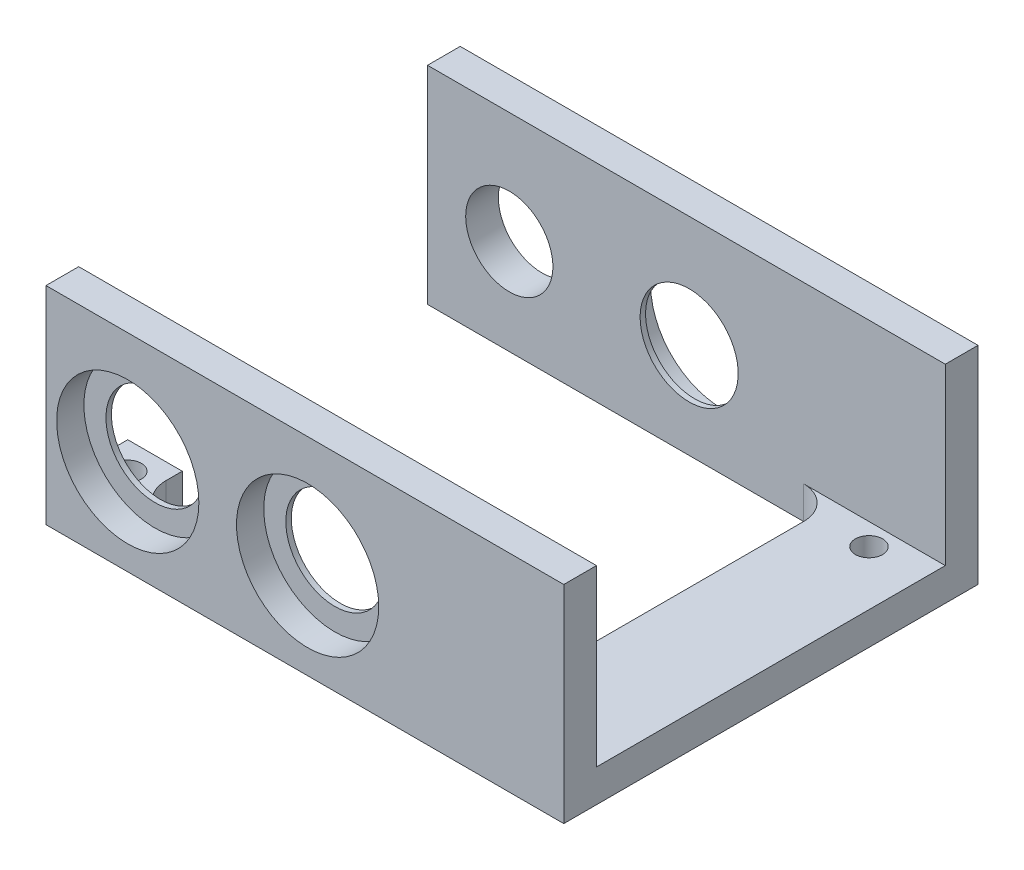
ISO-10303-21;
HEADER;
FILE_DESCRIPTION(('STEP AP214'),'2;1');
FILE_NAME('part.step','',(''),(''),'','','');
FILE_SCHEMA(('AUTOMOTIVE_DESIGN { 1 0 10303 214 1 1 1 1 }'));
ENDSEC;
DATA;
#1=APPLICATION_CONTEXT('core data for automotive mechanical design processes');
#2=APPLICATION_PROTOCOL_DEFINITION('international standard','automotive_design',2000,#1);
#3=PRODUCT_CONTEXT('',#1,'mechanical');
#4=PRODUCT('Part','Part','',(#3));
#5=PRODUCT_RELATED_PRODUCT_CATEGORY('part','',(#4));
#6=PRODUCT_DEFINITION_FORMATION('','',#4);
#7=PRODUCT_DEFINITION_CONTEXT('part definition',#1,'design');
#8=PRODUCT_DEFINITION('design','',#6,#7);
#9=PRODUCT_DEFINITION_SHAPE('','',#8);
#10=(LENGTH_UNIT() NAMED_UNIT(*) SI_UNIT(.MILLI.,.METRE.));
#11=(NAMED_UNIT(*) PLANE_ANGLE_UNIT() SI_UNIT($,.RADIAN.));
#12=(NAMED_UNIT(*) SI_UNIT($,.STERADIAN.) SOLID_ANGLE_UNIT());
#13=UNCERTAINTY_MEASURE_WITH_UNIT(LENGTH_MEASURE(1.E-05),#10,'distance_accuracy_value','');
#14=(GEOMETRIC_REPRESENTATION_CONTEXT(3) GLOBAL_UNCERTAINTY_ASSIGNED_CONTEXT((#13)) GLOBAL_UNIT_ASSIGNED_CONTEXT((#10,
#11,#12)) REPRESENTATION_CONTEXT('',''));
#15=CARTESIAN_POINT('',(0.,0.,0.));
#16=DIRECTION('',(0.,0.,1.));
#17=DIRECTION('',(1.,0.,0.));
#18=AXIS2_PLACEMENT_3D('',#15,#16,#17);
#19=CARTESIAN_POINT('',(8.43808713631623,7.98702095262566,6.));
#20=DIRECTION('',(0.,0.,-1.));
#21=DIRECTION('',(-1.,0.,0.));
#22=AXIS2_PLACEMENT_3D('',#19,#20,#21);
#23=CYLINDRICAL_SURFACE('',#22,9.);
#24=CARTESIAN_POINT('',(8.43808713631623,7.98702095262566,6.));
#25=DIRECTION('',(0.,0.,-1.));
#26=DIRECTION('',(-1.,0.,0.));
#27=AXIS2_PLACEMENT_3D('',#24,#25,#26);
#28=CIRCLE('',#27,9.);
#29=CARTESIAN_POINT('',(-0.561912863683773,7.98702095262566,6.));
#30=VERTEX_POINT('',#29);
#31=EDGE_CURVE('E312',#30,#30,#28,.T.);
#32=ORIENTED_EDGE('',*,*,#31,.F.);
#33=EDGE_LOOP('',(#32));
#34=FACE_BOUND('',#33,.T.);
#35=CARTESIAN_POINT('',(8.43808713631623,7.98702095262566,5.));
#36=DIRECTION('',(0.,0.,-1.));
#37=DIRECTION('',(-1.,0.,0.));
#38=AXIS2_PLACEMENT_3D('',#35,#36,#37);
#39=CIRCLE('',#38,9.);
#40=CARTESIAN_POINT('',(-0.561912863683773,7.98702095262566,5.));
#41=VERTEX_POINT('',#40);
#42=EDGE_CURVE('E308',#41,#41,#39,.F.);
#43=ORIENTED_EDGE('',*,*,#42,.F.);
#44=EDGE_LOOP('',(#43));
#45=FACE_BOUND('',#44,.T.);
#46=ADVANCED_FACE('F42',(#34,#45),#23,.F.);
#47=CARTESIAN_POINT('',(8.43808713631623,7.98702095262566,70.));
#48=DIRECTION('',(0.,0.,1.));
#49=DIRECTION('',(1.,0.,0.));
#50=AXIS2_PLACEMENT_3D('',#47,#48,#49);
#51=CYLINDRICAL_SURFACE('',#50,9.);
#52=CARTESIAN_POINT('',(8.43808713631623,7.98702095262566,70.));
#53=DIRECTION('',(0.,0.,1.));
#54=DIRECTION('',(1.,0.,0.));
#55=AXIS2_PLACEMENT_3D('',#52,#53,#54);
#56=CIRCLE('',#55,9.);
#57=CARTESIAN_POINT('',(17.4380871363162,7.98702095262566,70.));
#58=VERTEX_POINT('',#57);
#59=EDGE_CURVE('E188',#58,#58,#56,.T.);
#60=ORIENTED_EDGE('',*,*,#59,.F.);
#61=EDGE_LOOP('',(#60));
#62=FACE_BOUND('',#61,.T.);
#63=CARTESIAN_POINT('',(8.43808713631623,7.98702095262566,71.));
#64=DIRECTION('',(0.,0.,1.));
#65=DIRECTION('',(1.,0.,0.));
#66=AXIS2_PLACEMENT_3D('',#63,#64,#65);
#67=CIRCLE('',#66,9.);
#68=CARTESIAN_POINT('',(17.4380871363162,7.98702095262566,71.));
#69=VERTEX_POINT('',#68);
#70=EDGE_CURVE('E303',#69,#69,#67,.F.);
#71=ORIENTED_EDGE('',*,*,#70,.F.);
#72=EDGE_LOOP('',(#71));
#73=FACE_BOUND('',#72,.T.);
#74=ADVANCED_FACE('F414',(#62,#73),#51,.F.);
#75=CARTESIAN_POINT('',(-24.5619128636838,7.98702095262566,70.));
#76=DIRECTION('',(0.,0.,1.));
#77=DIRECTION('',(1.,0.,0.));
#78=AXIS2_PLACEMENT_3D('',#75,#76,#77);
#79=CYLINDRICAL_SURFACE('',#78,9.);
#80=CARTESIAN_POINT('',(-24.5619128636838,7.98702095262566,70.));
#81=DIRECTION('',(0.,0.,1.));
#82=DIRECTION('',(1.,0.,0.));
#83=AXIS2_PLACEMENT_3D('',#80,#81,#82);
#84=CIRCLE('',#83,9.);
#85=CARTESIAN_POINT('',(-15.5619128636838,7.98702095262566,70.));
#86=VERTEX_POINT('',#85);
#87=EDGE_CURVE('E196',#86,#86,#84,.T.);
#88=ORIENTED_EDGE('',*,*,#87,.F.);
#89=EDGE_LOOP('',(#88));
#90=FACE_BOUND('',#89,.T.);
#91=CARTESIAN_POINT('',(-24.5619128636838,7.98702095262566,71.));
#92=DIRECTION('',(0.,0.,1.));
#93=DIRECTION('',(1.,0.,0.));
#94=AXIS2_PLACEMENT_3D('',#91,#92,#93);
#95=CIRCLE('',#94,9.);
#96=CARTESIAN_POINT('',(-15.5619128636838,7.98702095262566,71.));
#97=VERTEX_POINT('',#96);
#98=EDGE_CURVE('E299',#97,#97,#95,.F.);
#99=ORIENTED_EDGE('',*,*,#98,.F.);
#100=EDGE_LOOP('',(#99));
#101=FACE_BOUND('',#100,.T.);
#102=ADVANCED_FACE('F420',(#90,#101),#79,.F.);
#103=CARTESIAN_POINT('',(-39.5619128636838,28.4870209526257,6.));
#104=DIRECTION('',(1.,0.,0.));
#105=DIRECTION('',(0.,0.,-1.));
#106=AXIS2_PLACEMENT_3D('',#103,#104,#105);
#107=PLANE('',#106);
#108=DIRECTION('',(0.,-1.,0.));
#109=VECTOR('',#108,1.);
#110=CARTESIAN_POINT('',(-39.5619128636838,28.4870209526257,0.));
#111=LINE('',#110,#109);
#112=CARTESIAN_POINT('',(-39.5619128636838,28.4870209526257,0.));
#113=VERTEX_POINT('',#112);
#114=CARTESIAN_POINT('',(-39.5619128636838,-9.51297904737435,0.));
#115=VERTEX_POINT('',#114);
#116=EDGE_CURVE('E252',#113,#115,#111,.T.);
#117=ORIENTED_EDGE('',*,*,#116,.T.);
#118=DIRECTION('',(0.,0.,-1.));
#119=VECTOR('',#118,1.);
#120=CARTESIAN_POINT('',(-39.5619128636838,-9.51297904737435,6.));
#121=LINE('',#120,#119);
#122=CARTESIAN_POINT('',(-39.5619128636838,-9.51297904737435,6.));
#123=VERTEX_POINT('',#122);
#124=EDGE_CURVE('E294',#123,#115,#121,.T.);
#125=ORIENTED_EDGE('',*,*,#124,.F.);
#126=DIRECTION('',(0.,-1.,0.));
#127=VECTOR('',#126,1.);
#128=CARTESIAN_POINT('',(-39.5619128636838,28.4870209526257,6.));
#129=LINE('',#128,#127);
#130=CARTESIAN_POINT('',(-39.5619128636838,28.4870209526257,6.));
#131=VERTEX_POINT('',#130);
#132=EDGE_CURVE('E256',#131,#123,#129,.T.);
#133=ORIENTED_EDGE('',*,*,#132,.F.);
#134=DIRECTION('',(0.,0.,-1.));
#135=VECTOR('',#134,1.);
#136=CARTESIAN_POINT('',(-39.5619128636838,28.4870209526257,6.));
#137=LINE('',#136,#135);
#138=EDGE_CURVE('E271',#131,#113,#137,.T.);
#139=ORIENTED_EDGE('',*,*,#138,.T.);
#140=EDGE_LOOP('',(#117,#125,#133,#139));
#141=FACE_BOUND('',#140,.T.);
#142=ADVANCED_FACE('F395',(#141),#107,.F.);
#143=CARTESIAN_POINT('',(-39.5619128636838,-9.51297904737435,6.));
#144=DIRECTION('',(0.,1.,0.));
#145=DIRECTION('',(0.,0.,1.));
#146=AXIS2_PLACEMENT_3D('',#143,#144,#145);
#147=PLANE('',#146);
#148=CARTESIAN_POINT('',(45.4375345031116,-9.51297904737435,10.));
#149=DIRECTION('',(0.,1.,0.));
#150=DIRECTION('',(0.,0.,1.));
#151=AXIS2_PLACEMENT_3D('',#148,#149,#150);
#152=CIRCLE('',#151,2.5);
#153=CARTESIAN_POINT('',(45.4375345031116,-9.51297904737435,12.5));
#154=VERTEX_POINT('',#153);
#155=EDGE_CURVE('E540',#154,#154,#152,.T.);
#156=ORIENTED_EDGE('',*,*,#155,.T.);
#157=EDGE_LOOP('',(#156));
#158=FACE_BOUND('',#157,.T.);
#159=CARTESIAN_POINT('',(45.4375345031116,-9.51297904737435,66.));
#160=DIRECTION('',(0.,1.,0.));
#161=DIRECTION('',(0.,0.,1.));
#162=AXIS2_PLACEMENT_3D('',#159,#160,#161);
#163=CIRCLE('',#162,2.5);
#164=CARTESIAN_POINT('',(45.4375345031116,-9.51297904737435,68.5));
#165=VERTEX_POINT('',#164);
#166=EDGE_CURVE('E552',#165,#165,#163,.T.);
#167=ORIENTED_EDGE('',*,*,#166,.T.);
#168=EDGE_LOOP('',(#167));
#169=FACE_BOUND('',#168,.T.);
#170=CARTESIAN_POINT('',(-34.5619128636838,-9.51297904737435,66.));
#171=DIRECTION('',(0.,1.,0.));
#172=DIRECTION('',(0.,0.,1.));
#173=AXIS2_PLACEMENT_3D('',#170,#171,#172);
#174=CIRCLE('',#173,2.5);
#175=CARTESIAN_POINT('',(-34.5619128636838,-9.51297904737435,68.5));
#176=VERTEX_POINT('',#175);
#177=EDGE_CURVE('E544',#176,#176,#174,.T.);
#178=ORIENTED_EDGE('',*,*,#177,.T.);
#179=EDGE_LOOP('',(#178));
#180=FACE_BOUND('',#179,.T.);
#181=DIRECTION('',(1.,0.,0.));
#182=VECTOR('',#181,1.);
#183=CARTESIAN_POINT('',(-39.5619128636838,-9.51297904737435,0.));
#184=LINE('',#183,#182);
#185=CARTESIAN_POINT('',(55.4380871363162,-9.51297904737435,0.));
#186=VERTEX_POINT('',#185);
#187=EDGE_CURVE('E275',#115,#186,#184,.T.);
#188=ORIENTED_EDGE('',*,*,#187,.T.);
#189=DIRECTION('',(0.,0.,-1.));
#190=VECTOR('',#189,1.);
#191=CARTESIAN_POINT('',(55.4380871363162,-9.51297904737435,6.));
#192=LINE('',#191,#190);
#193=CARTESIAN_POINT('',(55.4380871363162,-9.51297904737435,76.));
#194=VERTEX_POINT('',#193);
#195=EDGE_CURVE('E290',#194,#186,#192,.T.);
#196=ORIENTED_EDGE('',*,*,#195,.F.);
#197=DIRECTION('',(1.,0.,0.));
#198=VECTOR('',#197,1.);
#199=CARTESIAN_POINT('',(-39.5619128636838,-9.51297904737435,76.));
#200=LINE('',#199,#198);
#201=CARTESIAN_POINT('',(-39.5619128636838,-9.51297904737435,76.));
#202=VERTEX_POINT('',#201);
#203=EDGE_CURVE('E204',#202,#194,#200,.T.);
#204=ORIENTED_EDGE('',*,*,#203,.F.);
#205=DIRECTION('',(0.,0.,-1.));
#206=VECTOR('',#205,1.);
#207=CARTESIAN_POINT('',(-39.5619128636838,-9.51297904737435,76.));
#208=LINE('',#207,#206);
#209=CARTESIAN_POINT('',(-39.5619128636838,-9.51297904737435,61.));
#210=VERTEX_POINT('',#209);
#211=EDGE_CURVE('E233',#202,#210,#208,.T.);
#212=ORIENTED_EDGE('',*,*,#211,.T.);
#213=DIRECTION('',(1.,0.,0.));
#214=VECTOR('',#213,1.);
#215=CARTESIAN_POINT('',(-39.5619128636838,-9.51297904737435,61.));
#216=LINE('',#215,#214);
#217=CARTESIAN_POINT('',(-29.5619128636838,-9.51297904737435,61.));
#218=VERTEX_POINT('',#217);
#219=EDGE_CURVE('E161',#210,#218,#216,.T.);
#220=ORIENTED_EDGE('',*,*,#219,.T.);
#221=DIRECTION('',(0.,0.,1.));
#222=VECTOR('',#221,1.);
#223=CARTESIAN_POINT('',(-29.5619128636838,-9.51297904737435,70.));
#224=LINE('',#223,#222);
#225=CARTESIAN_POINT('',(-29.5619128636838,-9.51297904737435,64.));
#226=VERTEX_POINT('',#225);
#227=EDGE_CURVE('E181',#218,#226,#224,.T.);
#228=ORIENTED_EDGE('',*,*,#227,.T.);
#229=CARTESIAN_POINT('',(-23.5619128636838,-9.51297904737435,64.));
#230=DIRECTION('',(0.,1.,0.));
#231=DIRECTION('',(0.,0.,1.));
#232=AXIS2_PLACEMENT_3D('',#229,#230,#231);
#233=CIRCLE('',#232,6.);
#234=CARTESIAN_POINT('',(-23.5619128636838,-9.51297904737435,70.));
#235=VERTEX_POINT('',#234);
#236=EDGE_CURVE('E51',#226,#235,#233,.T.);
#237=ORIENTED_EDGE('',*,*,#236,.T.);
#238=DIRECTION('',(1.,0.,0.));
#239=VECTOR('',#238,1.);
#240=CARTESIAN_POINT('',(-39.5619128636838,-9.51297904737435,70.));
#241=LINE('',#240,#239);
#242=CARTESIAN_POINT('',(29.4369818699069,-9.51297904737435,70.));
#243=VERTEX_POINT('',#242);
#244=EDGE_CURVE('E218',#235,#243,#241,.T.);
#245=ORIENTED_EDGE('',*,*,#244,.T.);
#246=CARTESIAN_POINT('',(29.4369818699069,-9.51297904737435,64.));
#247=DIRECTION('',(0.,1.,0.));
#248=DIRECTION('',(0.,0.,1.));
#249=AXIS2_PLACEMENT_3D('',#246,#247,#248);
#250=CIRCLE('',#249,6.);
#251=CARTESIAN_POINT('',(35.4369818699069,-9.51297904737435,64.));
#252=VERTEX_POINT('',#251);
#253=EDGE_CURVE('E341',#243,#252,#250,.T.);
#254=ORIENTED_EDGE('',*,*,#253,.T.);
#255=DIRECTION('',(0.,0.,-1.));
#256=VECTOR('',#255,1.);
#257=CARTESIAN_POINT('',(35.4369818699069,-9.51297904737435,6.));
#258=LINE('',#257,#256);
#259=CARTESIAN_POINT('',(35.4369818699069,-9.51297904737435,12.));
#260=VERTEX_POINT('',#259);
#261=EDGE_CURVE('E236',#252,#260,#258,.T.);
#262=ORIENTED_EDGE('',*,*,#261,.T.);
#263=CARTESIAN_POINT('',(29.4369818699069,-9.51297904737435,12.));
#264=DIRECTION('',(0.,1.,0.));
#265=DIRECTION('',(0.,0.,1.));
#266=AXIS2_PLACEMENT_3D('',#263,#264,#265);
#267=CIRCLE('',#266,6.);
#268=CARTESIAN_POINT('',(29.4369818699069,-9.51297904737435,6.));
#269=VERTEX_POINT('',#268);
#270=EDGE_CURVE('E335',#260,#269,#267,.T.);
#271=ORIENTED_EDGE('',*,*,#270,.T.);
#272=DIRECTION('',(1.,0.,0.));
#273=VECTOR('',#272,1.);
#274=CARTESIAN_POINT('',(-39.5619128636838,-9.51297904737435,6.));
#275=LINE('',#274,#273);
#276=EDGE_CURVE('E260',#123,#269,#275,.T.);
#277=ORIENTED_EDGE('',*,*,#276,.F.);
#278=ORIENTED_EDGE('',*,*,#124,.T.);
#279=EDGE_LOOP('',(#188,#196,#204,#212,#220,#228,#237,#245,#254,#262,#271,#277,#278));
#280=FACE_BOUND('',#279,.T.);
#281=ADVANCED_FACE('F351',(#158,#169,#180,#280),#147,.F.);
#282=CARTESIAN_POINT('',(55.4380871363162,28.4870209526257,6.));
#283=DIRECTION('',(-1.,0.,0.));
#284=DIRECTION('',(0.,-1.,0.));
#285=AXIS2_PLACEMENT_3D('',#282,#283,#284);
#286=PLANE('',#285);
#287=DIRECTION('',(0.,1.,0.));
#288=VECTOR('',#287,1.);
#289=CARTESIAN_POINT('',(55.4380871363162,28.4870209526257,0.));
#290=LINE('',#289,#288);
#291=CARTESIAN_POINT('',(55.4380871363162,28.4870209526257,0.));
#292=VERTEX_POINT('',#291);
#293=EDGE_CURVE('E278',#186,#292,#290,.T.);
#294=ORIENTED_EDGE('',*,*,#293,.T.);
#295=DIRECTION('',(0.,0.,-1.));
#296=VECTOR('',#295,1.);
#297=CARTESIAN_POINT('',(55.4380871363162,28.4870209526257,6.));
#298=LINE('',#297,#296);
#299=CARTESIAN_POINT('',(55.4380871363162,28.4870209526257,6.));
#300=VERTEX_POINT('',#299);
#301=EDGE_CURVE('E286',#300,#292,#298,.T.);
#302=ORIENTED_EDGE('',*,*,#301,.F.);
#303=DIRECTION('',(0.,1.,0.));
#304=VECTOR('',#303,1.);
#305=CARTESIAN_POINT('',(55.4380871363162,28.4870209526257,6.));
#306=LINE('',#305,#304);
#307=CARTESIAN_POINT('',(55.4380871363162,-3.51297904737435,6.));
#308=VERTEX_POINT('',#307);
#309=EDGE_CURVE('E265',#308,#300,#306,.T.);
#310=ORIENTED_EDGE('',*,*,#309,.F.);
#311=DIRECTION('',(0.,0.,1.));
#312=VECTOR('',#311,1.);
#313=CARTESIAN_POINT('',(55.4380871363162,-3.51297904737434,6.));
#314=LINE('',#313,#312);
#315=CARTESIAN_POINT('',(55.4380871363162,-3.51297904737434,70.));
#316=VERTEX_POINT('',#315);
#317=EDGE_CURVE('E237',#308,#316,#314,.T.);
#318=ORIENTED_EDGE('',*,*,#317,.T.);
#319=DIRECTION('',(0.,1.,0.));
#320=VECTOR('',#319,1.);
#321=CARTESIAN_POINT('',(55.4380871363162,28.4870209526257,70.));
#322=LINE('',#321,#320);
#323=CARTESIAN_POINT('',(55.4380871363162,28.4870209526257,70.));
#324=VERTEX_POINT('',#323);
#325=EDGE_CURVE('E222',#316,#324,#322,.T.);
#326=ORIENTED_EDGE('',*,*,#325,.T.);
#327=DIRECTION('',(0.,0.,-1.));
#328=VECTOR('',#327,1.);
#329=CARTESIAN_POINT('',(55.4380871363162,28.4870209526257,76.));
#330=LINE('',#329,#328);
#331=CARTESIAN_POINT('',(55.4380871363162,28.4870209526257,76.));
#332=VERTEX_POINT('',#331);
#333=EDGE_CURVE('E229',#332,#324,#330,.T.);
#334=ORIENTED_EDGE('',*,*,#333,.F.);
#335=DIRECTION('',(0.,1.,0.));
#336=VECTOR('',#335,1.);
#337=CARTESIAN_POINT('',(55.4380871363162,28.4870209526257,76.));
#338=LINE('',#337,#336);
#339=EDGE_CURVE('E209',#194,#332,#338,.T.);
#340=ORIENTED_EDGE('',*,*,#339,.F.);
#341=ORIENTED_EDGE('',*,*,#195,.T.);
#342=EDGE_LOOP('',(#294,#302,#310,#318,#326,#334,#340,#341));
#343=FACE_BOUND('',#342,.T.);
#344=ADVANCED_FACE('F370',(#343),#286,.F.);
#345=CARTESIAN_POINT('',(-39.5619128636838,28.4870209526257,6.));
#346=DIRECTION('',(0.,-1.,0.));
#347=DIRECTION('',(0.,0.,-1.));
#348=AXIS2_PLACEMENT_3D('',#345,#346,#347);
#349=PLANE('',#348);
#350=DIRECTION('',(-1.,0.,0.));
#351=VECTOR('',#350,1.);
#352=CARTESIAN_POINT('',(-39.5619128636838,28.4870209526257,0.));
#353=LINE('',#352,#351);
#354=EDGE_CURVE('E261',#292,#113,#353,.T.);
#355=ORIENTED_EDGE('',*,*,#354,.T.);
#356=ORIENTED_EDGE('',*,*,#138,.F.);
#357=DIRECTION('',(-1.,0.,0.));
#358=VECTOR('',#357,1.);
#359=CARTESIAN_POINT('',(-39.5619128636838,28.4870209526257,6.));
#360=LINE('',#359,#358);
#361=EDGE_CURVE('E268',#300,#131,#360,.T.);
#362=ORIENTED_EDGE('',*,*,#361,.F.);
#363=ORIENTED_EDGE('',*,*,#301,.T.);
#364=EDGE_LOOP('',(#355,#356,#362,#363));
#365=FACE_BOUND('',#364,.T.);
#366=ADVANCED_FACE('F402',(#365),#349,.F.);
#367=CARTESIAN_POINT('',(0.,0.,6.));
#368=DIRECTION('',(0.,0.,1.));
#369=DIRECTION('',(1.,0.,0.));
#370=AXIS2_PLACEMENT_3D('',#367,#368,#369);
#371=PLANE('',#370);
#372=CARTESIAN_POINT('',(-24.5619128636838,7.98702095262566,6.));
#373=DIRECTION('',(0.,0.,-1.));
#374=DIRECTION('',(-1.,0.,0.));
#375=AXIS2_PLACEMENT_3D('',#372,#373,#374);
#376=CIRCLE('',#375,8.);
#377=CARTESIAN_POINT('',(-32.5619128636838,7.98702095262566,6.));
#378=VERTEX_POINT('',#377);
#379=EDGE_CURVE('E482',#378,#378,#376,.T.);
#380=ORIENTED_EDGE('',*,*,#379,.T.);
#381=EDGE_LOOP('',(#380));
#382=FACE_BOUND('',#381,.T.);
#383=ORIENTED_EDGE('',*,*,#31,.T.);
#384=EDGE_LOOP('',(#383));
#385=FACE_BOUND('',#384,.T.);
#386=ORIENTED_EDGE('',*,*,#276,.T.);
#387=DIRECTION('',(0.,-1.,0.));
#388=VECTOR('',#387,1.);
#389=CARTESIAN_POINT('',(29.4369818699069,-3.51297904737434,6.));
#390=LINE('',#389,#388);
#391=CARTESIAN_POINT('',(29.4369818699069,-3.51297904737434,6.));
#392=VERTEX_POINT('',#391);
#393=EDGE_CURVE('E320',#269,#392,#390,.F.);
#394=ORIENTED_EDGE('',*,*,#393,.T.);
#395=DIRECTION('',(1.,0.,0.));
#396=VECTOR('',#395,1.);
#397=CARTESIAN_POINT('',(55.4380871363162,-3.51297904737434,6.));
#398=LINE('',#397,#396);
#399=EDGE_CURVE('E248',#392,#308,#398,.T.);
#400=ORIENTED_EDGE('',*,*,#399,.T.);
#401=ORIENTED_EDGE('',*,*,#309,.T.);
#402=ORIENTED_EDGE('',*,*,#361,.T.);
#403=ORIENTED_EDGE('',*,*,#132,.T.);
#404=EDGE_LOOP('',(#386,#394,#400,#401,#402,#403));
#405=FACE_BOUND('',#404,.T.);
#406=ADVANCED_FACE('F376',(#382,#385,#405),#371,.T.);
#407=CARTESIAN_POINT('',(0.,0.,0.));
#408=DIRECTION('',(0.,0.,1.));
#409=DIRECTION('',(1.,0.,0.));
#410=AXIS2_PLACEMENT_3D('',#407,#408,#409);
#411=PLANE('',#410);
#412=CARTESIAN_POINT('',(8.43808713631623,7.98702095262566,0.));
#413=DIRECTION('',(0.,0.,-1.));
#414=DIRECTION('',(-1.,0.,0.));
#415=AXIS2_PLACEMENT_3D('',#412,#413,#414);
#416=CIRCLE('',#415,13.05);
#417=CARTESIAN_POINT('',(-4.61191286368377,7.98702095262566,0.));
#418=VERTEX_POINT('',#417);
#419=EDGE_CURVE('E476',#418,#418,#416,.T.);
#420=ORIENTED_EDGE('',*,*,#419,.F.);
#421=EDGE_LOOP('',(#420));
#422=FACE_BOUND('',#421,.T.);
#423=CARTESIAN_POINT('',(-24.5619128636838,7.98702095262566,0.));
#424=DIRECTION('',(0.,0.,-1.));
#425=DIRECTION('',(-1.,0.,0.));
#426=AXIS2_PLACEMENT_3D('',#423,#424,#425);
#427=CIRCLE('',#426,8.);
#428=CARTESIAN_POINT('',(-32.5619128636838,7.98702095262566,0.));
#429=VERTEX_POINT('',#428);
#430=EDGE_CURVE('E479',#429,#429,#427,.T.);
#431=ORIENTED_EDGE('',*,*,#430,.F.);
#432=EDGE_LOOP('',(#431));
#433=FACE_BOUND('',#432,.T.);
#434=ORIENTED_EDGE('',*,*,#116,.F.);
#435=ORIENTED_EDGE('',*,*,#354,.F.);
#436=ORIENTED_EDGE('',*,*,#293,.F.);
#437=ORIENTED_EDGE('',*,*,#187,.F.);
#438=EDGE_LOOP('',(#434,#435,#436,#437));
#439=FACE_BOUND('',#438,.T.);
#440=ADVANCED_FACE('F399',(#422,#433,#439),#411,.F.);
#441=CARTESIAN_POINT('',(35.4369818699069,-3.51297904737434,6.));
#442=DIRECTION('',(-1.,0.,0.));
#443=DIRECTION('',(0.,0.,1.));
#444=AXIS2_PLACEMENT_3D('',#441,#442,#443);
#445=PLANE('',#444);
#446=DIRECTION('',(0.,0.,-1.));
#447=VECTOR('',#446,1.);
#448=CARTESIAN_POINT('',(35.4369818699069,-3.51297904737434,6.));
#449=LINE('',#448,#447);
#450=CARTESIAN_POINT('',(35.4369818699069,-3.51297904737434,64.));
#451=VERTEX_POINT('',#450);
#452=CARTESIAN_POINT('',(35.4369818699069,-3.51297904737434,12.));
#453=VERTEX_POINT('',#452);
#454=EDGE_CURVE('E244',#451,#453,#449,.T.);
#455=ORIENTED_EDGE('',*,*,#454,.T.);
#456=DIRECTION('',(0.,-1.,0.));
#457=VECTOR('',#456,1.);
#458=CARTESIAN_POINT('',(35.4369818699069,-9.51297904737435,12.));
#459=LINE('',#458,#457);
#460=EDGE_CURVE('E316',#453,#260,#459,.T.);
#461=ORIENTED_EDGE('',*,*,#460,.T.);
#462=ORIENTED_EDGE('',*,*,#261,.F.);
#463=DIRECTION('',(0.,-1.,0.));
#464=VECTOR('',#463,1.);
#465=CARTESIAN_POINT('',(35.4369818699069,-3.51297904737434,64.));
#466=LINE('',#465,#464);
#467=EDGE_CURVE('E298',#252,#451,#466,.F.);
#468=ORIENTED_EDGE('',*,*,#467,.T.);
#469=EDGE_LOOP('',(#455,#461,#462,#468));
#470=FACE_BOUND('',#469,.T.);
#471=ADVANCED_FACE('F385',(#470),#445,.T.);
#472=CARTESIAN_POINT('',(0.,-3.51297904737434,0.));
#473=DIRECTION('',(0.,-1.,0.));
#474=DIRECTION('',(0.,0.,-1.));
#475=AXIS2_PLACEMENT_3D('',#472,#473,#474);
#476=PLANE('',#475);
#477=CARTESIAN_POINT('',(45.4375345031116,-3.51297904737434,10.));
#478=DIRECTION('',(0.,1.,0.));
#479=DIRECTION('',(0.,0.,1.));
#480=AXIS2_PLACEMENT_3D('',#477,#478,#479);
#481=CIRCLE('',#480,2.5);
#482=CARTESIAN_POINT('',(45.4375345031116,-3.51297904737434,12.5));
#483=VERTEX_POINT('',#482);
#484=EDGE_CURVE('E560',#483,#483,#481,.T.);
#485=ORIENTED_EDGE('',*,*,#484,.F.);
#486=EDGE_LOOP('',(#485));
#487=FACE_BOUND('',#486,.T.);
#488=CARTESIAN_POINT('',(45.4375345031116,-3.51297904737434,66.));
#489=DIRECTION('',(0.,1.,0.));
#490=DIRECTION('',(0.,0.,1.));
#491=AXIS2_PLACEMENT_3D('',#488,#489,#490);
#492=CIRCLE('',#491,2.5);
#493=CARTESIAN_POINT('',(45.4375345031116,-3.51297904737434,68.5));
#494=VERTEX_POINT('',#493);
#495=EDGE_CURVE('E556',#494,#494,#492,.T.);
#496=ORIENTED_EDGE('',*,*,#495,.F.);
#497=EDGE_LOOP('',(#496));
#498=FACE_BOUND('',#497,.T.);
#499=ORIENTED_EDGE('',*,*,#317,.F.);
#500=ORIENTED_EDGE('',*,*,#399,.F.);
#501=CARTESIAN_POINT('',(29.4369818699069,-3.51297904737434,12.));
#502=DIRECTION('',(0.,-1.,0.));
#503=DIRECTION('',(0.,0.,-1.));
#504=AXIS2_PLACEMENT_3D('',#501,#502,#503);
#505=CIRCLE('',#504,6.);
#506=EDGE_CURVE('E338',#392,#453,#505,.T.);
#507=ORIENTED_EDGE('',*,*,#506,.T.);
#508=ORIENTED_EDGE('',*,*,#454,.F.);
#509=CARTESIAN_POINT('',(29.4369818699069,-3.51297904737434,64.));
#510=DIRECTION('',(0.,-1.,0.));
#511=DIRECTION('',(0.,0.,-1.));
#512=AXIS2_PLACEMENT_3D('',#509,#510,#511);
#513=CIRCLE('',#512,6.);
#514=CARTESIAN_POINT('',(29.4369818699069,-3.51297904737434,70.));
#515=VERTEX_POINT('',#514);
#516=EDGE_CURVE('E344',#451,#515,#513,.T.);
#517=ORIENTED_EDGE('',*,*,#516,.T.);
#518=DIRECTION('',(-1.,0.,0.));
#519=VECTOR('',#518,1.);
#520=CARTESIAN_POINT('',(55.4380871363162,-3.51297904737434,70.));
#521=LINE('',#520,#519);
#522=EDGE_CURVE('E241',#316,#515,#521,.T.);
#523=ORIENTED_EDGE('',*,*,#522,.F.);
#524=EDGE_LOOP('',(#499,#500,#507,#508,#517,#523));
#525=FACE_BOUND('',#524,.T.);
#526=ADVANCED_FACE('F374',(#487,#498,#525),#476,.F.);
#527=CARTESIAN_POINT('',(0.,0.,70.));
#528=DIRECTION('',(0.,0.,1.));
#529=DIRECTION('',(1.,0.,0.));
#530=AXIS2_PLACEMENT_3D('',#527,#528,#529);
#531=PLANE('',#530);
#532=ORIENTED_EDGE('',*,*,#87,.T.);
#533=EDGE_LOOP('',(#532));
#534=FACE_BOUND('',#533,.T.);
#535=ORIENTED_EDGE('',*,*,#59,.T.);
#536=EDGE_LOOP('',(#535));
#537=FACE_BOUND('',#536,.T.);
#538=ORIENTED_EDGE('',*,*,#522,.T.);
#539=DIRECTION('',(0.,-1.,0.));
#540=VECTOR('',#539,1.);
#541=CARTESIAN_POINT('',(29.4369818699069,0.,70.));
#542=LINE('',#541,#540);
#543=EDGE_CURVE('E328',#515,#243,#542,.T.);
#544=ORIENTED_EDGE('',*,*,#543,.T.);
#545=ORIENTED_EDGE('',*,*,#244,.F.);
#546=DIRECTION('',(0.,-1.,0.));
#547=VECTOR('',#546,1.);
#548=CARTESIAN_POINT('',(-23.5619128636838,0.,70.));
#549=LINE('',#548,#547);
#550=CARTESIAN_POINT('',(-23.5619128636838,-3.51297904737434,70.));
#551=VERTEX_POINT('',#550);
#552=EDGE_CURVE('E324',#235,#551,#549,.F.);
#553=ORIENTED_EDGE('',*,*,#552,.T.);
#554=DIRECTION('',(-1.,0.,0.));
#555=VECTOR('',#554,1.);
#556=CARTESIAN_POINT('',(-39.5619128636838,-3.51297904737434,70.));
#557=LINE('',#556,#555);
#558=CARTESIAN_POINT('',(-39.5619128636838,-3.51297904737434,70.));
#559=VERTEX_POINT('',#558);
#560=EDGE_CURVE('E167',#551,#559,#557,.T.);
#561=ORIENTED_EDGE('',*,*,#560,.T.);
#562=DIRECTION('',(0.,-1.,0.));
#563=VECTOR('',#562,1.);
#564=CARTESIAN_POINT('',(-39.5619128636838,28.4870209526257,70.));
#565=LINE('',#564,#563);
#566=CARTESIAN_POINT('',(-39.5619128636838,28.4870209526257,70.));
#567=VERTEX_POINT('',#566);
#568=EDGE_CURVE('E179',#567,#559,#565,.T.);
#569=ORIENTED_EDGE('',*,*,#568,.F.);
#570=DIRECTION('',(-1.,0.,0.));
#571=VECTOR('',#570,1.);
#572=CARTESIAN_POINT('',(-39.5619128636838,28.4870209526257,70.));
#573=LINE('',#572,#571);
#574=EDGE_CURVE('E205',#324,#567,#573,.T.);
#575=ORIENTED_EDGE('',*,*,#574,.F.);
#576=ORIENTED_EDGE('',*,*,#325,.F.);
#577=EDGE_LOOP('',(#538,#544,#545,#553,#561,#569,#575,#576));
#578=FACE_BOUND('',#577,.T.);
#579=ADVANCED_FACE('F354',(#534,#537,#578),#531,.F.);
#580=CARTESIAN_POINT('',(-39.5619128636838,28.4870209526257,76.));
#581=DIRECTION('',(1.,0.,0.));
#582=DIRECTION('',(0.,1.,0.));
#583=AXIS2_PLACEMENT_3D('',#580,#581,#582);
#584=PLANE('',#583);
#585=ORIENTED_EDGE('',*,*,#568,.T.);
#586=DIRECTION('',(0.,0.,-1.));
#587=VECTOR('',#586,1.);
#588=CARTESIAN_POINT('',(-39.5619128636838,-3.51297904737434,70.));
#589=LINE('',#588,#587);
#590=CARTESIAN_POINT('',(-39.5619128636838,-3.51297904737434,61.));
#591=VERTEX_POINT('',#590);
#592=EDGE_CURVE('E170',#559,#591,#589,.T.);
#593=ORIENTED_EDGE('',*,*,#592,.T.);
#594=DIRECTION('',(0.,-1.,0.));
#595=VECTOR('',#594,1.);
#596=CARTESIAN_POINT('',(-39.5619128636838,-3.51297904737434,61.));
#597=LINE('',#596,#595);
#598=EDGE_CURVE('E156',#591,#210,#597,.T.);
#599=ORIENTED_EDGE('',*,*,#598,.T.);
#600=ORIENTED_EDGE('',*,*,#211,.F.);
#601=DIRECTION('',(0.,-1.,0.));
#602=VECTOR('',#601,1.);
#603=CARTESIAN_POINT('',(-39.5619128636838,28.4870209526257,76.));
#604=LINE('',#603,#602);
#605=CARTESIAN_POINT('',(-39.5619128636838,28.4870209526257,76.));
#606=VERTEX_POINT('',#605);
#607=EDGE_CURVE('E200',#606,#202,#604,.T.);
#608=ORIENTED_EDGE('',*,*,#607,.F.);
#609=DIRECTION('',(0.,0.,-1.));
#610=VECTOR('',#609,1.);
#611=CARTESIAN_POINT('',(-39.5619128636838,28.4870209526257,76.));
#612=LINE('',#611,#610);
#613=EDGE_CURVE('E215',#606,#567,#612,.T.);
#614=ORIENTED_EDGE('',*,*,#613,.T.);
#615=EDGE_LOOP('',(#585,#593,#599,#600,#608,#614));
#616=FACE_BOUND('',#615,.T.);
#617=ADVANCED_FACE('F176',(#616),#584,.F.);
#618=CARTESIAN_POINT('',(-39.5619128636838,28.4870209526257,76.));
#619=DIRECTION('',(0.,-1.,0.));
#620=DIRECTION('',(0.,0.,-1.));
#621=AXIS2_PLACEMENT_3D('',#618,#619,#620);
#622=PLANE('',#621);
#623=ORIENTED_EDGE('',*,*,#574,.T.);
#624=ORIENTED_EDGE('',*,*,#613,.F.);
#625=DIRECTION('',(-1.,0.,0.));
#626=VECTOR('',#625,1.);
#627=CARTESIAN_POINT('',(-39.5619128636838,28.4870209526257,76.));
#628=LINE('',#627,#626);
#629=EDGE_CURVE('E212',#332,#606,#628,.T.);
#630=ORIENTED_EDGE('',*,*,#629,.F.);
#631=ORIENTED_EDGE('',*,*,#333,.T.);
#632=EDGE_LOOP('',(#623,#624,#630,#631));
#633=FACE_BOUND('',#632,.T.);
#634=ADVANCED_FACE('F366',(#633),#622,.F.);
#635=CARTESIAN_POINT('',(0.,0.,76.));
#636=DIRECTION('',(0.,0.,1.));
#637=DIRECTION('',(1.,0.,0.));
#638=AXIS2_PLACEMENT_3D('',#635,#636,#637);
#639=PLANE('',#638);
#640=CARTESIAN_POINT('',(-24.5619128636838,7.98702095262566,76.));
#641=DIRECTION('',(0.,0.,1.));
#642=DIRECTION('',(1.,0.,0.));
#643=AXIS2_PLACEMENT_3D('',#640,#641,#642);
#644=CIRCLE('',#643,13.05);
#645=CARTESIAN_POINT('',(-11.5119128636838,7.98702095262566,76.));
#646=VERTEX_POINT('',#645);
#647=EDGE_CURVE('E497',#646,#646,#644,.T.);
#648=ORIENTED_EDGE('',*,*,#647,.F.);
#649=EDGE_LOOP('',(#648));
#650=FACE_BOUND('',#649,.T.);
#651=CARTESIAN_POINT('',(8.43808713631623,7.98702095262566,76.));
#652=DIRECTION('',(0.,0.,1.));
#653=DIRECTION('',(1.,0.,0.));
#654=AXIS2_PLACEMENT_3D('',#651,#652,#653);
#655=CIRCLE('',#654,13.05);
#656=CARTESIAN_POINT('',(21.4880871363162,7.98702095262566,76.));
#657=VERTEX_POINT('',#656);
#658=EDGE_CURVE('E501',#657,#657,#655,.T.);
#659=ORIENTED_EDGE('',*,*,#658,.F.);
#660=EDGE_LOOP('',(#659));
#661=FACE_BOUND('',#660,.T.);
#662=ORIENTED_EDGE('',*,*,#607,.T.);
#663=ORIENTED_EDGE('',*,*,#203,.T.);
#664=ORIENTED_EDGE('',*,*,#339,.T.);
#665=ORIENTED_EDGE('',*,*,#629,.T.);
#666=EDGE_LOOP('',(#662,#663,#664,#665));
#667=FACE_BOUND('',#666,.T.);
#668=ADVANCED_FACE('F361',(#650,#661,#667),#639,.T.);
#669=CARTESIAN_POINT('',(-29.5619128636838,-3.51297904737434,70.));
#670=DIRECTION('',(1.,0.,0.));
#671=DIRECTION('',(0.,0.,-1.));
#672=AXIS2_PLACEMENT_3D('',#669,#670,#671);
#673=PLANE('',#672);
#674=DIRECTION('',(0.,0.,1.));
#675=VECTOR('',#674,1.);
#676=CARTESIAN_POINT('',(-29.5619128636838,-3.51297904737434,70.));
#677=LINE('',#676,#675);
#678=CARTESIAN_POINT('',(-29.5619128636838,-3.51297904737434,61.));
#679=VERTEX_POINT('',#678);
#680=CARTESIAN_POINT('',(-29.5619128636838,-3.51297904737434,64.));
#681=VERTEX_POINT('',#680);
#682=EDGE_CURVE('E172',#679,#681,#677,.T.);
#683=ORIENTED_EDGE('',*,*,#682,.T.);
#684=DIRECTION('',(0.,-1.,0.));
#685=VECTOR('',#684,1.);
#686=CARTESIAN_POINT('',(-29.5619128636838,-3.51297904737434,64.));
#687=LINE('',#686,#685);
#688=EDGE_CURVE('E332',#681,#226,#687,.T.);
#689=ORIENTED_EDGE('',*,*,#688,.T.);
#690=ORIENTED_EDGE('',*,*,#227,.F.);
#691=DIRECTION('',(0.,-1.,0.));
#692=VECTOR('',#691,1.);
#693=CARTESIAN_POINT('',(-29.5619128636838,-3.51297904737434,61.));
#694=LINE('',#693,#692);
#695=EDGE_CURVE('E166',#679,#218,#694,.T.);
#696=ORIENTED_EDGE('',*,*,#695,.F.);
#697=EDGE_LOOP('',(#683,#689,#690,#696));
#698=FACE_BOUND('',#697,.T.);
#699=ADVANCED_FACE('F357',(#698),#673,.T.);
#700=CARTESIAN_POINT('',(-39.5619128636838,-3.51297904737434,61.));
#701=DIRECTION('',(0.,0.,-1.));
#702=DIRECTION('',(-1.,0.,0.));
#703=AXIS2_PLACEMENT_3D('',#700,#701,#702);
#704=PLANE('',#703);
#705=ORIENTED_EDGE('',*,*,#219,.F.);
#706=ORIENTED_EDGE('',*,*,#598,.F.);
#707=DIRECTION('',(1.,0.,0.));
#708=VECTOR('',#707,1.);
#709=CARTESIAN_POINT('',(-39.5619128636838,-3.51297904737434,61.));
#710=LINE('',#709,#708);
#711=EDGE_CURVE('E159',#591,#679,#710,.T.);
#712=ORIENTED_EDGE('',*,*,#711,.T.);
#713=ORIENTED_EDGE('',*,*,#695,.T.);
#714=EDGE_LOOP('',(#705,#706,#712,#713));
#715=FACE_BOUND('',#714,.T.);
#716=ADVANCED_FACE('F158',(#715),#704,.T.);
#717=CARTESIAN_POINT('',(0.,-3.51297904737434,0.));
#718=DIRECTION('',(0.,-1.,0.));
#719=DIRECTION('',(0.,0.,-1.));
#720=AXIS2_PLACEMENT_3D('',#717,#718,#719);
#721=PLANE('',#720);
#722=CARTESIAN_POINT('',(-34.5619128636838,-3.51297904737434,66.));
#723=DIRECTION('',(0.,1.,0.));
#724=DIRECTION('',(0.,0.,1.));
#725=AXIS2_PLACEMENT_3D('',#722,#723,#724);
#726=CIRCLE('',#725,2.5);
#727=CARTESIAN_POINT('',(-34.5619128636838,-3.51297904737434,68.5));
#728=VERTEX_POINT('',#727);
#729=EDGE_CURVE('E548',#728,#728,#726,.T.);
#730=ORIENTED_EDGE('',*,*,#729,.F.);
#731=EDGE_LOOP('',(#730));
#732=FACE_BOUND('',#731,.T.);
#733=ORIENTED_EDGE('',*,*,#592,.F.);
#734=ORIENTED_EDGE('',*,*,#560,.F.);
#735=CARTESIAN_POINT('',(-23.5619128636838,-3.51297904737434,64.));
#736=DIRECTION('',(0.,-1.,0.));
#737=DIRECTION('',(0.,0.,-1.));
#738=AXIS2_PLACEMENT_3D('',#735,#736,#737);
#739=CIRCLE('',#738,6.);
#740=EDGE_CURVE('E11',#551,#681,#739,.T.);
#741=ORIENTED_EDGE('',*,*,#740,.T.);
#742=ORIENTED_EDGE('',*,*,#682,.F.);
#743=ORIENTED_EDGE('',*,*,#711,.F.);
#744=EDGE_LOOP('',(#733,#734,#741,#742,#743));
#745=FACE_BOUND('',#744,.T.);
#746=ADVANCED_FACE('F169',(#732,#745),#721,.F.);
#747=CARTESIAN_POINT('',(-24.5619128636838,7.98702095262566,71.));
#748=DIRECTION('',(0.,0.,1.));
#749=DIRECTION('',(1.,0.,0.));
#750=AXIS2_PLACEMENT_3D('',#747,#748,#749);
#751=PLANE('',#750);
#752=CARTESIAN_POINT('',(-24.5619128636838,7.98702095262566,71.));
#753=DIRECTION('',(0.,0.,1.));
#754=DIRECTION('',(1.,0.,0.));
#755=AXIS2_PLACEMENT_3D('',#752,#753,#754);
#756=CIRCLE('',#755,13.05);
#757=CARTESIAN_POINT('',(-11.5119128636838,7.98702095262566,71.));
#758=VERTEX_POINT('',#757);
#759=EDGE_CURVE('E304',#758,#758,#756,.T.);
#760=ORIENTED_EDGE('',*,*,#759,.T.);
#761=EDGE_LOOP('',(#760));
#762=FACE_BOUND('',#761,.T.);
#763=ORIENTED_EDGE('',*,*,#98,.T.);
#764=EDGE_LOOP('',(#763));
#765=FACE_BOUND('',#764,.T.);
#766=ADVANCED_FACE('F429',(#762,#765),#751,.T.);
#767=CARTESIAN_POINT('',(-24.5619128636838,7.98702095262566,71.));
#768=DIRECTION('',(0.,0.,1.));
#769=DIRECTION('',(1.,0.,0.));
#770=AXIS2_PLACEMENT_3D('',#767,#768,#769);
#771=CYLINDRICAL_SURFACE('',#770,13.05);
#772=ORIENTED_EDGE('',*,*,#759,.F.);
#773=EDGE_LOOP('',(#772));
#774=FACE_BOUND('',#773,.T.);
#775=ORIENTED_EDGE('',*,*,#647,.T.);
#776=EDGE_LOOP('',(#775));
#777=FACE_BOUND('',#776,.T.);
#778=ADVANCED_FACE('F432',(#774,#777),#771,.F.);
#779=CARTESIAN_POINT('',(8.43808713631623,7.98702095262566,71.));
#780=DIRECTION('',(0.,0.,1.));
#781=DIRECTION('',(1.,0.,0.));
#782=AXIS2_PLACEMENT_3D('',#779,#780,#781);
#783=PLANE('',#782);
#784=CARTESIAN_POINT('',(8.43808713631623,7.98702095262566,71.));
#785=DIRECTION('',(0.,0.,1.));
#786=DIRECTION('',(1.,0.,0.));
#787=AXIS2_PLACEMENT_3D('',#784,#785,#786);
#788=CIRCLE('',#787,13.05);
#789=CARTESIAN_POINT('',(21.4880871363162,7.98702095262566,71.));
#790=VERTEX_POINT('',#789);
#791=EDGE_CURVE('E488',#790,#790,#788,.T.);
#792=ORIENTED_EDGE('',*,*,#791,.T.);
#793=EDGE_LOOP('',(#792));
#794=FACE_BOUND('',#793,.T.);
#795=ORIENTED_EDGE('',*,*,#70,.T.);
#796=EDGE_LOOP('',(#795));
#797=FACE_BOUND('',#796,.T.);
#798=ADVANCED_FACE('F436',(#794,#797),#783,.T.);
#799=CARTESIAN_POINT('',(8.43808713631623,7.98702095262566,71.));
#800=DIRECTION('',(0.,0.,1.));
#801=DIRECTION('',(1.,0.,0.));
#802=AXIS2_PLACEMENT_3D('',#799,#800,#801);
#803=CYLINDRICAL_SURFACE('',#802,13.05);
#804=ORIENTED_EDGE('',*,*,#791,.F.);
#805=EDGE_LOOP('',(#804));
#806=FACE_BOUND('',#805,.T.);
#807=ORIENTED_EDGE('',*,*,#658,.T.);
#808=EDGE_LOOP('',(#807));
#809=FACE_BOUND('',#808,.T.);
#810=ADVANCED_FACE('F438',(#806,#809),#803,.F.);
#811=CARTESIAN_POINT('',(-24.5619128636838,7.98702095262566,6.));
#812=DIRECTION('',(0.,0.,-1.));
#813=DIRECTION('',(-1.,0.,0.));
#814=AXIS2_PLACEMENT_3D('',#811,#812,#813);
#815=CYLINDRICAL_SURFACE('',#814,8.);
#816=ORIENTED_EDGE('',*,*,#379,.F.);
#817=EDGE_LOOP('',(#816));
#818=FACE_BOUND('',#817,.T.);
#819=ORIENTED_EDGE('',*,*,#430,.T.);
#820=EDGE_LOOP('',(#819));
#821=FACE_BOUND('',#820,.T.);
#822=ADVANCED_FACE('F427',(#818,#821),#815,.F.);
#823=CARTESIAN_POINT('',(8.43808713631623,7.98702095262566,5.));
#824=DIRECTION('',(0.,0.,-1.));
#825=DIRECTION('',(-1.,0.,0.));
#826=AXIS2_PLACEMENT_3D('',#823,#824,#825);
#827=PLANE('',#826);
#828=CARTESIAN_POINT('',(8.43808713631623,7.98702095262566,5.));
#829=DIRECTION('',(0.,0.,-1.));
#830=DIRECTION('',(-1.,0.,0.));
#831=AXIS2_PLACEMENT_3D('',#828,#829,#830);
#832=CIRCLE('',#831,13.05);
#833=CARTESIAN_POINT('',(-4.61191286368377,7.98702095262566,5.));
#834=VERTEX_POINT('',#833);
#835=EDGE_CURVE('E313',#834,#834,#832,.T.);
#836=ORIENTED_EDGE('',*,*,#835,.T.);
#837=EDGE_LOOP('',(#836));
#838=FACE_BOUND('',#837,.T.);
#839=ORIENTED_EDGE('',*,*,#42,.T.);
#840=EDGE_LOOP('',(#839));
#841=FACE_BOUND('',#840,.T.);
#842=ADVANCED_FACE('F592',(#838,#841),#827,.T.);
#843=CARTESIAN_POINT('',(8.43808713631623,7.98702095262566,5.));
#844=DIRECTION('',(0.,0.,-1.));
#845=DIRECTION('',(-1.,0.,0.));
#846=AXIS2_PLACEMENT_3D('',#843,#844,#845);
#847=CYLINDRICAL_SURFACE('',#846,13.05);
#848=ORIENTED_EDGE('',*,*,#835,.F.);
#849=EDGE_LOOP('',(#848));
#850=FACE_BOUND('',#849,.T.);
#851=ORIENTED_EDGE('',*,*,#419,.T.);
#852=EDGE_LOOP('',(#851));
#853=FACE_BOUND('',#852,.T.);
#854=ADVANCED_FACE('F587',(#850,#853),#847,.F.);
#855=CARTESIAN_POINT('',(-34.5619128636838,-9.51297904737435,66.));
#856=DIRECTION('',(0.,1.,0.));
#857=DIRECTION('',(0.,0.,1.));
#858=AXIS2_PLACEMENT_3D('',#855,#856,#857);
#859=CYLINDRICAL_SURFACE('',#858,2.5);
#860=ORIENTED_EDGE('',*,*,#177,.F.);
#861=EDGE_LOOP('',(#860));
#862=FACE_BOUND('',#861,.T.);
#863=ORIENTED_EDGE('',*,*,#729,.T.);
#864=EDGE_LOOP('',(#863));
#865=FACE_BOUND('',#864,.T.);
#866=ADVANCED_FACE('F581',(#862,#865),#859,.F.);
#867=CARTESIAN_POINT('',(45.4375345031116,-9.51297904737435,66.));
#868=DIRECTION('',(0.,1.,0.));
#869=DIRECTION('',(0.,0.,1.));
#870=AXIS2_PLACEMENT_3D('',#867,#868,#869);
#871=CYLINDRICAL_SURFACE('',#870,2.5);
#872=ORIENTED_EDGE('',*,*,#166,.F.);
#873=EDGE_LOOP('',(#872));
#874=FACE_BOUND('',#873,.T.);
#875=ORIENTED_EDGE('',*,*,#495,.T.);
#876=EDGE_LOOP('',(#875));
#877=FACE_BOUND('',#876,.T.);
#878=ADVANCED_FACE('F574',(#874,#877),#871,.F.);
#879=CARTESIAN_POINT('',(45.4375345031116,-9.51297904737435,10.));
#880=DIRECTION('',(0.,1.,0.));
#881=DIRECTION('',(0.,0.,1.));
#882=AXIS2_PLACEMENT_3D('',#879,#880,#881);
#883=CYLINDRICAL_SURFACE('',#882,2.5);
#884=ORIENTED_EDGE('',*,*,#155,.F.);
#885=EDGE_LOOP('',(#884));
#886=FACE_BOUND('',#885,.T.);
#887=ORIENTED_EDGE('',*,*,#484,.T.);
#888=EDGE_LOOP('',(#887));
#889=FACE_BOUND('',#888,.T.);
#890=ADVANCED_FACE('F571',(#886,#889),#883,.F.);
#891=CARTESIAN_POINT('',(29.4369818699069,-3.51297904737434,12.));
#892=DIRECTION('',(0.,1.,0.));
#893=DIRECTION('',(0.,0.,1.));
#894=AXIS2_PLACEMENT_3D('',#891,#892,#893);
#895=CYLINDRICAL_SURFACE('',#894,6.);
#896=ORIENTED_EDGE('',*,*,#506,.F.);
#897=ORIENTED_EDGE('',*,*,#393,.F.);
#898=ORIENTED_EDGE('',*,*,#270,.F.);
#899=ORIENTED_EDGE('',*,*,#460,.F.);
#900=EDGE_LOOP('',(#896,#897,#898,#899));
#901=FACE_BOUND('',#900,.T.);
#902=ADVANCED_FACE('F381',(#901),#895,.F.);
#903=CARTESIAN_POINT('',(29.4369818699069,0.,64.));
#904=DIRECTION('',(0.,-1.,0.));
#905=DIRECTION('',(0.,0.,-1.));
#906=AXIS2_PLACEMENT_3D('',#903,#904,#905);
#907=CYLINDRICAL_SURFACE('',#906,6.);
#908=ORIENTED_EDGE('',*,*,#516,.F.);
#909=ORIENTED_EDGE('',*,*,#467,.F.);
#910=ORIENTED_EDGE('',*,*,#253,.F.);
#911=ORIENTED_EDGE('',*,*,#543,.F.);
#912=EDGE_LOOP('',(#908,#909,#910,#911));
#913=FACE_BOUND('',#912,.T.);
#914=ADVANCED_FACE('F389',(#913),#907,.F.);
#915=CARTESIAN_POINT('',(-23.5619128636838,-3.51297904737434,64.));
#916=DIRECTION('',(0.,-1.,0.));
#917=DIRECTION('',(0.,0.,-1.));
#918=AXIS2_PLACEMENT_3D('',#915,#916,#917);
#919=CYLINDRICAL_SURFACE('',#918,6.);
#920=ORIENTED_EDGE('',*,*,#740,.F.);
#921=ORIENTED_EDGE('',*,*,#552,.F.);
#922=ORIENTED_EDGE('',*,*,#236,.F.);
#923=ORIENTED_EDGE('',*,*,#688,.F.);
#924=EDGE_LOOP('',(#920,#921,#922,#923));
#925=FACE_BOUND('',#924,.T.);
#926=ADVANCED_FACE('F44',(#925),#919,.F.);
#927=CLOSED_SHELL('',(#46,#74,#102,#142,#281,#344,#366,#406,#440,#471,#526,#579,#617,#634,#668,
#699,#716,#746,#766,#778,#798,#810,#822,#842,#854,#866,#878,#890,#902,#914,#926));
#928=MANIFOLD_SOLID_BREP('B2',#927);
#929=ADVANCED_BREP_SHAPE_REPRESENTATION('',(#18,#928),#14);
#930=SHAPE_DEFINITION_REPRESENTATION(#9,#929);
ENDSEC;
END-ISO-10303-21;
